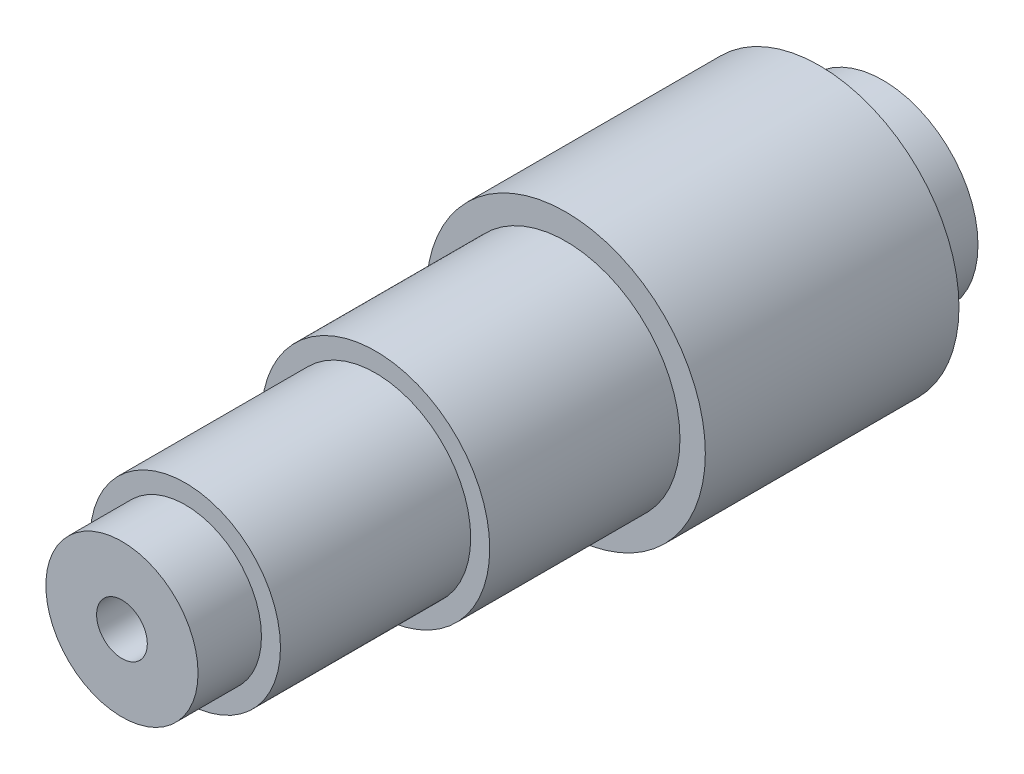
ISO-10303-21;
HEADER;
FILE_DESCRIPTION(('STEP AP214'),'2;1');
FILE_NAME('part.step','',(''),(''),'','','');
FILE_SCHEMA(('AUTOMOTIVE_DESIGN { 1 0 10303 214 1 1 1 1 }'));
ENDSEC;
DATA;
#1=APPLICATION_CONTEXT('core data for automotive mechanical design processes');
#2=APPLICATION_PROTOCOL_DEFINITION('international standard','automotive_design',2000,#1);
#3=PRODUCT_CONTEXT('',#1,'mechanical');
#4=PRODUCT('Part','Part','',(#3));
#5=PRODUCT_RELATED_PRODUCT_CATEGORY('part','',(#4));
#6=PRODUCT_DEFINITION_FORMATION('','',#4);
#7=PRODUCT_DEFINITION_CONTEXT('part definition',#1,'design');
#8=PRODUCT_DEFINITION('design','',#6,#7);
#9=PRODUCT_DEFINITION_SHAPE('','',#8);
#10=(LENGTH_UNIT() NAMED_UNIT(*) SI_UNIT(.MILLI.,.METRE.));
#11=(NAMED_UNIT(*) PLANE_ANGLE_UNIT() SI_UNIT($,.RADIAN.));
#12=(NAMED_UNIT(*) SI_UNIT($,.STERADIAN.) SOLID_ANGLE_UNIT());
#13=UNCERTAINTY_MEASURE_WITH_UNIT(LENGTH_MEASURE(1.E-05),#10,'distance_accuracy_value','');
#14=(GEOMETRIC_REPRESENTATION_CONTEXT(3) GLOBAL_UNCERTAINTY_ASSIGNED_CONTEXT((#13)) GLOBAL_UNIT_ASSIGNED_CONTEXT((#10,
#11,#12)) REPRESENTATION_CONTEXT('',''));
#15=CARTESIAN_POINT('',(0.,0.,0.));
#16=DIRECTION('',(0.,0.,1.));
#17=DIRECTION('',(1.,0.,0.));
#18=AXIS2_PLACEMENT_3D('',#15,#16,#17);
#19=CARTESIAN_POINT('',(0.,0.,80.));
#20=DIRECTION('',(0.,0.,1.));
#21=DIRECTION('',(1.,0.,0.));
#22=AXIS2_PLACEMENT_3D('',#19,#20,#21);
#23=PLANE('',#22);
#24=CARTESIAN_POINT('',(0.,0.,80.));
#25=DIRECTION('',(0.,0.,1.));
#26=DIRECTION('',(1.,0.,0.));
#27=AXIS2_PLACEMENT_3D('',#24,#25,#26);
#28=CIRCLE('',#27,15.);
#29=CARTESIAN_POINT('',(15.,0.,80.));
#30=VERTEX_POINT('',#29);
#31=EDGE_CURVE('E28',#30,#30,#28,.T.);
#32=ORIENTED_EDGE('',*,*,#31,.F.);
#33=EDGE_LOOP('',(#32));
#34=FACE_BOUND('',#33,.T.);
#35=CARTESIAN_POINT('',(0.,0.,80.));
#36=DIRECTION('',(0.,0.,1.));
#37=DIRECTION('',(1.,0.,0.));
#38=AXIS2_PLACEMENT_3D('',#35,#36,#37);
#39=CIRCLE('',#38,18.);
#40=CARTESIAN_POINT('',(18.,0.,80.));
#41=VERTEX_POINT('',#40);
#42=EDGE_CURVE('E46',#41,#41,#39,.T.);
#43=ORIENTED_EDGE('',*,*,#42,.T.);
#44=EDGE_LOOP('',(#43));
#45=FACE_BOUND('',#44,.T.);
#46=ADVANCED_FACE('F16',(#34,#45),#23,.T.);
#47=CARTESIAN_POINT('',(0.,0.,80.));
#48=DIRECTION('',(0.,0.,1.));
#49=DIRECTION('',(1.,0.,0.));
#50=AXIS2_PLACEMENT_3D('',#47,#48,#49);
#51=CYLINDRICAL_SURFACE('',#50,15.);
#52=ORIENTED_EDGE('',*,*,#31,.T.);
#53=DIRECTION('',(0.,0.,1.));
#54=VECTOR('',#53,1.);
#55=CARTESIAN_POINT('',(15.,0.,80.));
#56=LINE('',#55,#54);
#57=CARTESIAN_POINT('',(15.,0.,110.));
#58=VERTEX_POINT('',#57);
#59=EDGE_CURVE('E10',#30,#58,#56,.T.);
#60=ORIENTED_EDGE('',*,*,#59,.T.);
#61=CARTESIAN_POINT('',(0.,0.,110.));
#62=DIRECTION('',(0.,0.,1.));
#63=DIRECTION('',(1.,0.,0.));
#64=AXIS2_PLACEMENT_3D('',#61,#62,#63);
#65=CIRCLE('',#64,15.);
#66=EDGE_CURVE('E131',#58,#58,#65,.T.);
#67=ORIENTED_EDGE('',*,*,#66,.F.);
#68=ORIENTED_EDGE('',*,*,#59,.F.);
#69=EDGE_LOOP('',(#52,#60,#67,#68));
#70=FACE_BOUND('',#69,.T.);
#71=ADVANCED_FACE('F18',(#70),#51,.T.);
#72=CARTESIAN_POINT('',(0.,0.,50.));
#73=DIRECTION('',(0.,0.,1.));
#74=DIRECTION('',(1.,0.,0.));
#75=AXIS2_PLACEMENT_3D('',#72,#73,#74);
#76=CYLINDRICAL_SURFACE('',#75,18.);
#77=CARTESIAN_POINT('',(0.,0.,50.));
#78=DIRECTION('',(0.,0.,1.));
#79=DIRECTION('',(1.,0.,0.));
#80=AXIS2_PLACEMENT_3D('',#77,#78,#79);
#81=CIRCLE('',#80,18.);
#82=CARTESIAN_POINT('',(18.,0.,50.));
#83=VERTEX_POINT('',#82);
#84=EDGE_CURVE('E136',#83,#83,#81,.T.);
#85=ORIENTED_EDGE('',*,*,#84,.T.);
#86=DIRECTION('',(0.,0.,1.));
#87=VECTOR('',#86,1.);
#88=CARTESIAN_POINT('',(18.,0.,50.));
#89=LINE('',#88,#87);
#90=EDGE_CURVE('E135',#83,#41,#89,.T.);
#91=ORIENTED_EDGE('',*,*,#90,.T.);
#92=ORIENTED_EDGE('',*,*,#42,.F.);
#93=ORIENTED_EDGE('',*,*,#90,.F.);
#94=EDGE_LOOP('',(#85,#91,#92,#93));
#95=FACE_BOUND('',#94,.T.);
#96=ADVANCED_FACE('F352',(#95),#76,.T.);
#97=CARTESIAN_POINT('',(0.,0.,110.));
#98=DIRECTION('',(0.,0.,1.));
#99=DIRECTION('',(1.,0.,0.));
#100=AXIS2_PLACEMENT_3D('',#97,#98,#99);
#101=PLANE('',#100);
#102=CARTESIAN_POINT('',(0.,0.,110.));
#103=DIRECTION('',(0.,0.,1.));
#104=DIRECTION('',(1.,0.,0.));
#105=AXIS2_PLACEMENT_3D('',#102,#103,#104);
#106=CIRCLE('',#105,12.);
#107=CARTESIAN_POINT('',(12.,0.,110.));
#108=VERTEX_POINT('',#107);
#109=EDGE_CURVE('E162',#108,#108,#106,.T.);
#110=ORIENTED_EDGE('',*,*,#109,.F.);
#111=EDGE_LOOP('',(#110));
#112=FACE_BOUND('',#111,.T.);
#113=ORIENTED_EDGE('',*,*,#66,.T.);
#114=EDGE_LOOP('',(#113));
#115=FACE_BOUND('',#114,.T.);
#116=ADVANCED_FACE('F355',(#112,#115),#101,.T.);
#117=CARTESIAN_POINT('',(0.,0.,50.));
#118=DIRECTION('',(0.,0.,1.));
#119=DIRECTION('',(1.,0.,0.));
#120=AXIS2_PLACEMENT_3D('',#117,#118,#119);
#121=PLANE('',#120);
#122=ORIENTED_EDGE('',*,*,#84,.F.);
#123=EDGE_LOOP('',(#122));
#124=FACE_BOUND('',#123,.T.);
#125=CARTESIAN_POINT('',(0.,0.,50.));
#126=DIRECTION('',(0.,0.,1.));
#127=DIRECTION('',(1.,0.,0.));
#128=AXIS2_PLACEMENT_3D('',#125,#126,#127);
#129=CIRCLE('',#128,22.);
#130=CARTESIAN_POINT('',(22.,0.,50.));
#131=VERTEX_POINT('',#130);
#132=EDGE_CURVE('E161',#131,#131,#129,.T.);
#133=ORIENTED_EDGE('',*,*,#132,.T.);
#134=EDGE_LOOP('',(#133));
#135=FACE_BOUND('',#134,.T.);
#136=ADVANCED_FACE('F264',(#124,#135),#121,.T.);
#137=CARTESIAN_POINT('',(0.,0.,110.));
#138=DIRECTION('',(0.,0.,1.));
#139=DIRECTION('',(1.,0.,0.));
#140=AXIS2_PLACEMENT_3D('',#137,#138,#139);
#141=CYLINDRICAL_SURFACE('',#140,12.);
#142=ORIENTED_EDGE('',*,*,#109,.T.);
#143=DIRECTION('',(0.,0.,1.));
#144=VECTOR('',#143,1.);
#145=CARTESIAN_POINT('',(12.,0.,110.));
#146=LINE('',#145,#144);
#147=CARTESIAN_POINT('',(12.,0.,120.));
#148=VERTEX_POINT('',#147);
#149=EDGE_CURVE('E166',#108,#148,#146,.T.);
#150=ORIENTED_EDGE('',*,*,#149,.T.);
#151=CARTESIAN_POINT('',(0.,0.,120.));
#152=DIRECTION('',(0.,0.,1.));
#153=DIRECTION('',(1.,0.,0.));
#154=AXIS2_PLACEMENT_3D('',#151,#152,#153);
#155=CIRCLE('',#154,12.);
#156=EDGE_CURVE('E152',#148,#148,#155,.T.);
#157=ORIENTED_EDGE('',*,*,#156,.F.);
#158=ORIENTED_EDGE('',*,*,#149,.F.);
#159=EDGE_LOOP('',(#142,#150,#157,#158));
#160=FACE_BOUND('',#159,.T.);
#161=ADVANCED_FACE('F362',(#160),#141,.T.);
#162=CARTESIAN_POINT('',(0.,0.,10.));
#163=DIRECTION('',(0.,0.,1.));
#164=DIRECTION('',(1.,0.,0.));
#165=AXIS2_PLACEMENT_3D('',#162,#163,#164);
#166=CYLINDRICAL_SURFACE('',#165,22.);
#167=CARTESIAN_POINT('',(0.,0.,10.));
#168=DIRECTION('',(0.,0.,1.));
#169=DIRECTION('',(1.,0.,0.));
#170=AXIS2_PLACEMENT_3D('',#167,#168,#169);
#171=CIRCLE('',#170,22.);
#172=CARTESIAN_POINT('',(22.,0.,10.));
#173=VERTEX_POINT('',#172);
#174=EDGE_CURVE('E142',#173,#173,#171,.T.);
#175=ORIENTED_EDGE('',*,*,#174,.T.);
#176=DIRECTION('',(0.,0.,1.));
#177=VECTOR('',#176,1.);
#178=CARTESIAN_POINT('',(22.,0.,10.));
#179=LINE('',#178,#177);
#180=EDGE_CURVE('E156',#173,#131,#179,.T.);
#181=ORIENTED_EDGE('',*,*,#180,.T.);
#182=ORIENTED_EDGE('',*,*,#132,.F.);
#183=ORIENTED_EDGE('',*,*,#180,.F.);
#184=EDGE_LOOP('',(#175,#181,#182,#183));
#185=FACE_BOUND('',#184,.T.);
#186=ADVANCED_FACE('F263',(#185),#166,.T.);
#187=CARTESIAN_POINT('',(0.,0.,120.));
#188=DIRECTION('',(0.,0.,1.));
#189=DIRECTION('',(1.,0.,0.));
#190=AXIS2_PLACEMENT_3D('',#187,#188,#189);
#191=PLANE('',#190);
#192=CARTESIAN_POINT('',(0.,0.,120.));
#193=DIRECTION('',(0.,0.,-1.));
#194=DIRECTION('',(1.,0.,0.));
#195=AXIS2_PLACEMENT_3D('',#192,#193,#194);
#196=CIRCLE('',#195,4.);
#197=CARTESIAN_POINT('',(4.,0.,120.));
#198=VERTEX_POINT('',#197);
#199=EDGE_CURVE('E137',#198,#198,#196,.T.);
#200=ORIENTED_EDGE('',*,*,#199,.T.);
#201=EDGE_LOOP('',(#200));
#202=FACE_BOUND('',#201,.T.);
#203=ORIENTED_EDGE('',*,*,#156,.T.);
#204=EDGE_LOOP('',(#203));
#205=FACE_BOUND('',#204,.T.);
#206=ADVANCED_FACE('F202',(#202,#205),#191,.T.);
#207=CARTESIAN_POINT('',(1.5155,0.,0.4375));
#208=CARTESIAN_POINT('',(3.402393074912,0.479611392546,0.460817608106));
#209=CARTESIAN_POINT('',(5.116920711234,2.273915754895,0.520411328068));
#210=CARTESIAN_POINT('',(5.902808231949,5.316430468505,0.615382807903));
#211=CARTESIAN_POINT('',(4.978240031538,9.082938753713,0.748265761617));
#212=CARTESIAN_POINT('',(1.990043169276,12.58856914041,0.9138210966));
#213=CARTESIAN_POINT('',(-2.924226933672,14.658866904373,1.120147120799));
#214=CARTESIAN_POINT('',(-8.767328616036,14.37485235099,1.357821338647));
#215=CARTESIAN_POINT('',(-14.34258800773,11.493958477222,1.634710819825));
#216=CARTESIAN_POINT('',(-18.45080375576,6.427195028999,1.945905064948));
#217=CARTESIAN_POINT('',(-20.3366596334,0.05209941645208,2.293297334482));
#218=CARTESIAN_POINT('',(-22.22240311658,-6.322997026243,2.640673979179));
#219=CARTESIAN_POINT('',(-21.87999161717,-14.00730158028,3.023438283921));
#220=CARTESIAN_POINT('',(-18.55226095051,-22.12169037234,3.442902493528));
#221=CARTESIAN_POINT('',(-11.83337665121,-29.33920089672,3.896441355612));
#222=CARTESIAN_POINT('',(-2.10156022312,-34.0531217601,4.385471531116));
#223=CARTESIAN_POINT('',(9.529332184227,-34.88306114543,4.91257780741));
#224=CARTESIAN_POINT('',(21.10030150827,-31.14833019398,5.46916351957));
#225=CARTESIAN_POINT('',(30.712389118464,-23.25397205846,6.066244878642));
#226=CARTESIAN_POINT('',(36.825685446813,-12.40470621421,6.694115112968));
#227=CARTESIAN_POINT('',(38.709446183388,-0.274728714199,7.357943894031));
#228=CARTESIAN_POINT('',(-1.5155,0.,0.4375));
#229=CARTESIAN_POINT('',(0.371393074913,-0.46980809349,0.408617479808));
#230=CARTESIAN_POINT('',(2.417355959542,0.37489894699,0.416148659816));
#231=CARTESIAN_POINT('',(3.866213435088,2.599022678202,0.458772997383));
#232=CARTESIAN_POINT('',(3.876899213397,5.806811410503,0.539742927108));
#233=CARTESIAN_POINT('',(1.978901282863,9.116530719101,0.653229350093));
#234=CARTESIAN_POINT('',(-1.848106665434,11.386129925145,0.807399445798));
#235=CARTESIAN_POINT('',(-6.762457105953,11.660362247993,0.9935017398));
#236=CARTESIAN_POINT('',(-11.68246034699,9.592329079429,1.218472526964));
#237=CARTESIAN_POINT('',(-15.46442446361,5.464245332898,1.478167284807));
#238=CARTESIAN_POINT('',(-17.35057828473,0.02451465844215,1.774145853499));
#239=CARTESIAN_POINT('',(-19.23661917247,-5.415216681936,2.070111888369));
#240=CARTESIAN_POINT('',(-19.2210252537,-12.16728970778,2.401710816562));
#241=CARTESIAN_POINT('',(-16.54424122369,-19.48169387672,2.769958682475));
#242=CARTESIAN_POINT('',(-10.73959963305,-26.15697514808,3.172941720924));
#243=CARTESIAN_POINT('',(-2.068296010453,-30.68400243376,3.611191495813));
#244=CARTESIAN_POINT('',(8.510187967542,-31.71051619926,4.087954408512));
#245=CARTESIAN_POINT('',(19.186638988229,-28.51743318513,4.594669373541));
#246=CARTESIAN_POINT('',(28.170527772547,-21.40598170801,5.141810454707));
#247=CARTESIAN_POINT('',(33.972428698166,-11.45679678302,5.720351336437));
#248=CARTESIAN_POINT('',(35.856779767768,-0.22037826069,6.335055166262));
#249=(BOUNDED_SURFACE() B_SPLINE_SURFACE(1,10,((#207,#208,#209,#210,#211,#212,#213,#214,#215,
#216,#217,#218,#219,#220,#221,#222,#223,#224,#225,#226,#227),(#228,#229,#230,#231,#232,#233,
#234,#235,#236,#237,#238,#239,#240,#241,#242,#243,#244,#245,#246,#247,#248)),.UNSPECIFIED.,.F.,
.F.,.F.) B_SPLINE_SURFACE_WITH_KNOTS((2,2),(11,9,1,11),(0.,3.031),(0.,0.5,0.5000005,1.),
.UNSPECIFIED.) GEOMETRIC_REPRESENTATION_ITEM() RATIONAL_B_SPLINE_SURFACE(((1.,1.,1.,1.,1.,1.,1.,
1.,1.,1.,1.,1.,1.,1.,1.,1.,1.,1.,1.,1.,1.),(1.,1.,1.,1.,1.,1.,1.,1.,1.,1.,1.,1.,1.,1.,1.,1.,1.,
1.,1.,1.,1.))) REPRESENTATION_ITEM('') SURFACE());
#250=CARTESIAN_POINT('',(1.5155,0.,0.4375));
#251=CARTESIAN_POINT('',(3.402393074912,0.479611392546,0.460817608106));
#252=CARTESIAN_POINT('',(5.116920711234,2.273915754895,0.520411328068));
#253=CARTESIAN_POINT('',(5.902808231949,5.316430468505,0.615382807903));
#254=CARTESIAN_POINT('',(4.978240031538,9.082938753713,0.748265761617));
#255=CARTESIAN_POINT('',(1.990043169276,12.58856914041,0.9138210966));
#256=CARTESIAN_POINT('',(-2.924226933672,14.658866904373,1.120147120799));
#257=CARTESIAN_POINT('',(-8.767328616036,14.37485235099,1.357821338647));
#258=CARTESIAN_POINT('',(-14.34258800773,11.493958477222,1.634710819825));
#259=CARTESIAN_POINT('',(-18.45080375576,6.427195028999,1.945905064948));
#260=CARTESIAN_POINT('',(-20.3366596334,0.05209941645208,2.293297334482));
#261=CARTESIAN_POINT('',(-22.22240311658,-6.322997026243,2.640673979179));
#262=CARTESIAN_POINT('',(-21.87999161717,-14.00730158028,3.023438283921));
#263=CARTESIAN_POINT('',(-18.55226095051,-22.12169037234,3.442902493528));
#264=CARTESIAN_POINT('',(-11.83337665121,-29.33920089672,3.896441355612));
#265=CARTESIAN_POINT('',(-2.10156022312,-34.0531217601,4.385471531116));
#266=CARTESIAN_POINT('',(9.529332184227,-34.88306114543,4.91257780741));
#267=CARTESIAN_POINT('',(21.10030150827,-31.14833019398,5.46916351957));
#268=CARTESIAN_POINT('',(30.712389118464,-23.25397205846,6.066244878642));
#269=CARTESIAN_POINT('',(36.825685446813,-12.40470621421,6.694115112968));
#270=CARTESIAN_POINT('',(38.709446183388,-0.274728714199,7.357943894031));
#271=(BOUNDED_CURVE() B_SPLINE_CURVE(10,(#250,#251,#252,#253,#254,#255,#256,#257,#258,#259,#260,
#261,#262,#263,#264,#265,#266,#267,#268,#269,#270),.UNSPECIFIED.,.F.,
.F.) B_SPLINE_CURVE_WITH_KNOTS((11,9,1,11),(0.,0.5,0.5000005,1.),
.UNSPECIFIED.) CURVE() GEOMETRIC_REPRESENTATION_ITEM() RATIONAL_B_SPLINE_CURVE((1.,1.,1.,1.,1.,
1.,1.,1.,1.,1.,1.,1.,1.,1.,1.,1.,1.,1.,1.,1.,1.)) REPRESENTATION_ITEM(''));
#272=CARTESIAN_POINT('',(3.661261292306,1.610951814755,0.496412822207));
#273=VERTEX_POINT('',#272);
#274=CARTESIAN_POINT('',(-9.375339181256,11.709099676593,1.435178396942));
#275=VERTEX_POINT('',#274);
#276=EDGE_CURVE('E320',#273,#275,#271,.T.);
#277=CARTESIAN_POINT('',(2.421851776586,3.183493988096,0.491941061582));
#278=CARTESIAN_POINT('',(2.522494284354,3.106929924477,0.494841673041));
#279=CARTESIAN_POINT('',(2.61991981264,3.026115732131,0.49730577537));
#280=CARTESIAN_POINT('',(2.713855902493,2.94125563373,0.499333172147));
#281=CARTESIAN_POINT('',(2.894258091973,2.763922490141,0.502514242423));
#282=CARTESIAN_POINT('',(2.980724619241,2.671449552217,0.503667946758));
#283=CARTESIAN_POINT('',(3.063214275254,2.575406576045,0.50438471997));
#284=CARTESIAN_POINT('',(3.219817568093,2.376715277817,0.504944263259));
#285=CARTESIAN_POINT('',(3.293931352072,2.2740667857,0.504787034388));
#286=CARTESIAN_POINT('',(3.363646307471,2.168382690352,0.504192733704));
#287=CARTESIAN_POINT('',(3.493931663672,1.951523178685,0.502129907622));
#288=CARTESIAN_POINT('',(3.554501822564,1.84034737384,0.500661349274));
#289=CARTESIAN_POINT('',(3.610323575551,1.726719579479,0.498755641256));
#290=CARTESIAN_POINT('',(3.661261292306,1.610951814755,0.496412822207));
#291=(BOUNDED_CURVE() B_SPLINE_CURVE(4,(#277,#278,#279,#280,#281,#282,#283,#284,#285,#286,#287,
#288,#289,#290),.UNSPECIFIED.,.F.,.F.) B_SPLINE_CURVE_WITH_KNOTS((5,3,3,3,5),(0.,0.250004413169,
0.500000012832,0.749995265298,1.),
.UNSPECIFIED.) CURVE() GEOMETRIC_REPRESENTATION_ITEM() RATIONAL_B_SPLINE_CURVE((1.,1.,1.,1.,1.,
1.,1.,1.,1.,1.,1.,1.,1.,1.)) REPRESENTATION_ITEM(''));
#292=CARTESIAN_POINT('',(2.421851776586,3.183493988096,0.491941061582));
#293=VERTEX_POINT('',#292);
#294=EDGE_CURVE('E140',#293,#273,#291,.T.);
#295=CARTESIAN_POINT('',(-1.51549981481574,0.,0.4375));
#296=CARTESIAN_POINT('',(0.371393260097255,-0.469808035483553,0.408617482997258));
#297=CARTESIAN_POINT('',(2.41735612447664,0.374899063013759,0.41614866618611));
#298=CARTESIAN_POINT('',(3.86621355951733,2.59902284422679,0.458773006951351));
#299=CARTESIAN_POINT('',(3.87689928068535,5.80681161066374,0.539742939848068));
#300=CARTESIAN_POINT('',(1.97890128354373,9.11653093123127,0.653229366014309));
#301=CARTESIAN_POINT('',(-1.84810673118145,11.3861301250986,0.807399464905867));
#302=CARTESIAN_POINT('',(-6.76245722844414,11.6603624138395,0.993501762058744));
#303=CARTESIAN_POINT('',(-11.6824605095152,9.59232919561238,1.21847255239481));
#304=CARTESIAN_POINT('',(-15.4644246460681,5.4642453917311,1.47816731338426));
#305=CARTESIAN_POINT('',(-17.3505784671699,0.0245146601274891,1.77414588521747));
#306=CARTESIAN_POINT('',(-19.2366193548917,-5.41521673739843,2.07011192322849));
#307=CARTESIAN_POINT('',(-19.2210254161542,-12.1672898201988,2.40171085454753));
#308=CARTESIAN_POINT('',(-16.5442413463735,-19.4816940380152,2.76995872358968));
#309=CARTESIAN_POINT('',(-10.7395996998762,-26.1569753425037,3.17294176512748));
#310=CARTESIAN_POINT('',(-2.06829601248534,-30.6840026396022,3.61119154311899));
#311=CARTESIAN_POINT('',(8.5101880298084,-31.7105163930922,4.08795445889381));
#312=CARTESIAN_POINT('',(19.1866391051476,-28.5174333458693,4.59466942696975));
#313=CARTESIAN_POINT('',(28.1705279278465,-21.4059818209162,5.14181051118694));
#314=CARTESIAN_POINT('',(33.9724288724907,-11.4567968409342,5.7203513959308));
#315=CARTESIAN_POINT('',(35.8567799420567,-0.220378264010636,6.33505522875718));
#316=(BOUNDED_CURVE() B_SPLINE_CURVE(10,(#295,#296,#297,#298,#299,#300,#301,#302,#303,#304,#305,
#306,#307,#308,#309,#310,#311,#312,#313,#314,#315),.UNSPECIFIED.,.F.,
.F.) B_SPLINE_CURVE_WITH_KNOTS((11,9,1,11),(0.,0.5,0.5000005,1.),
.UNSPECIFIED.) CURVE() GEOMETRIC_REPRESENTATION_ITEM() RATIONAL_B_SPLINE_CURVE((1.,1.,1.,1.,1.,
1.,1.,1.,1.,1.,1.,1.,1.,1.,1.,1.,1.,1.,1.,1.,1.)) REPRESENTATION_ITEM(''));
#317=CARTESIAN_POINT('',(-13.8531549113,5.752399412724,1.429449729147));
#318=VERTEX_POINT('',#317);
#319=EDGE_CURVE('E157',#293,#318,#316,.T.);
#320=CARTESIAN_POINT('',(-13.8531549113,5.752399412724,1.429449729147));
#321=CARTESIAN_POINT('',(-13.67298827883,6.186283795637,1.432452749044));
#322=CARTESIAN_POINT('',(-13.47468957751,6.612675421907,1.435013969642));
#323=CARTESIAN_POINT('',(-13.25872579868,7.030433452274,1.437133914994));
#324=CARTESIAN_POINT('',(-12.79243793424,7.846961091187,1.440494206657));
#325=CARTESIAN_POINT('',(-12.54207767972,8.245711192297,1.441733629794));
#326=CARTESIAN_POINT('',(-12.27523190239,8.633656619334,1.442532055099));
#327=CARTESIAN_POINT('',(-11.7097704186,9.386322955494,1.443248516813));
#328=CARTESIAN_POINT('',(-11.41112306494,9.751021337901,1.443165681705));
#329=CARTESIAN_POINT('',(-11.09744080005,10.102903338274,1.442642229396));
#330=CARTESIAN_POINT('',(-10.44143180215,10.779552628647,1.44071436561));
#331=CARTESIAN_POINT('',(-10.09907855061,11.104295590852,1.439309149653));
#332=CARTESIAN_POINT('',(-9.743390649836,11.414405169808,1.437463662038));
#333=CARTESIAN_POINT('',(-9.375339181256,11.709099676593,1.435178396942));
#334=(BOUNDED_CURVE() B_SPLINE_CURVE(4,(#320,#321,#322,#323,#324,#325,#326,#327,#328,#329,#330,
#331,#332,#333),.UNSPECIFIED.,.F.,.F.) B_SPLINE_CURVE_WITH_KNOTS((5,3,3,3,5),(0.,0.24962379835,
0.499508800478,0.749640356011,1.),
.UNSPECIFIED.) CURVE() GEOMETRIC_REPRESENTATION_ITEM() RATIONAL_B_SPLINE_CURVE((1.,1.,1.,1.,1.,
1.,1.,1.,1.,1.,1.,1.,1.,1.)) REPRESENTATION_ITEM(''));
#335=EDGE_CURVE('E236',#318,#275,#334,.T.);
#336=ORIENTED_EDGE('',*,*,#276,.F.);
#337=ORIENTED_EDGE('',*,*,#294,.F.);
#338=ORIENTED_EDGE('',*,*,#319,.T.);
#339=ORIENTED_EDGE('',*,*,#335,.T.);
#340=EDGE_LOOP('',(#336,#337,#338,#339));
#341=FACE_BOUND('',#340,.T.);
#342=ADVANCED_FACE('F189',(#341),#249,.T.);
#343=CARTESIAN_POINT('',(-1.5155,0.,0.4375));
#344=CARTESIAN_POINT('',(0.371393074913,-0.46980809349,0.408617479808));
#345=CARTESIAN_POINT('',(2.417355959542,0.37489894699,0.416148659816));
#346=CARTESIAN_POINT('',(3.866213435088,2.599022678202,0.458772997383));
#347=CARTESIAN_POINT('',(3.876899213397,5.806811410503,0.539742927108));
#348=CARTESIAN_POINT('',(1.978901282863,9.116530719101,0.653229350094));
#349=CARTESIAN_POINT('',(-1.848106665435,11.386129925145,0.807399445798));
#350=CARTESIAN_POINT('',(-6.762457105952,11.660362247993,0.9935017398));
#351=CARTESIAN_POINT('',(-11.68246034699,9.592329079429,1.218472526964));
#352=CARTESIAN_POINT('',(-15.46442446361,5.464245332898,1.478167284807));
#353=CARTESIAN_POINT('',(-17.35057828473,0.02451465844214,1.774145853499));
#354=CARTESIAN_POINT('',(-19.23661917247,-5.415216681936,2.070111888369));
#355=CARTESIAN_POINT('',(-19.2210252537,-12.16728970778,2.401710816562));
#356=CARTESIAN_POINT('',(-16.54424122368,-19.48169387673,2.769958682475));
#357=CARTESIAN_POINT('',(-10.73959963305,-26.15697514808,3.172941720924));
#358=CARTESIAN_POINT('',(-2.068296010449,-30.68400243376,3.611191495813));
#359=CARTESIAN_POINT('',(8.510187967539,-31.71051619926,4.087954408513));
#360=CARTESIAN_POINT('',(19.186638988231,-28.51743318513,4.594669373541));
#361=CARTESIAN_POINT('',(28.170527772546,-21.40598170801,5.141810454707));
#362=CARTESIAN_POINT('',(33.972428698166,-11.45679678302,5.720351336437));
#363=CARTESIAN_POINT('',(35.856779767768,-0.22037826069,6.335055166262));
#364=CARTESIAN_POINT('',(0.,0.,0.));
#365=CARTESIAN_POINT('',(1.894427735464,0.004901897782642,-0.002782456042913));
#366=CARTESIAN_POINT('',(3.782187623936,1.32965857106,0.03092417453794));
#367=CARTESIAN_POINT('',(4.904034599493,3.973469993534,0.100008930031));
#368=CARTESIAN_POINT('',(4.445291318495,7.474530574897,0.207371473497));
#369=CARTESIAN_POINT('',(1.992473556593,10.89578570163,0.347459685475));
#370=CARTESIAN_POINT('',(-2.395562802775,13.074402682446,0.528438309312));
#371=CARTESIAN_POINT('',(-7.795699275625,13.069508202221,0.741179439983));
#372=CARTESIAN_POINT('',(-13.06421937901,10.58522482383,0.993120744068));
#373=CARTESIAN_POINT('',(-17.02502031889,5.969536489041,1.279711341485));
#374=CARTESIAN_POINT('',(-18.91855421955,0.03865051317334,1.602686979649));
#375=CARTESIAN_POINT('',(-20.81197501013,-5.892236214851,1.925648460915));
#376=CARTESIAN_POINT('',(-20.63229595345,-13.13911032363,2.284260323225));
#377=CARTESIAN_POINT('',(-17.61814570562,-20.88416162055,2.679693405458));
#378=CARTESIAN_POINT('',(-11.33154645111,-27.85816872069,3.109664222553));
#379=CARTESIAN_POINT('',(-2.093483209639,-32.49700385231,3.575156889506));
#380=CARTESIAN_POINT('',(9.055251414737,-33.42895947767,4.079094073757));
#381=CARTESIAN_POINT('',(20.223076389534,-29.95135112509,4.612862397628));
#382=CARTESIAN_POINT('',(29.55794010848,-22.41875418764,5.187253649773));
#383=CARTESIAN_POINT('',(35.539183429487,-11.97836307987,5.792859185071));
#384=CARTESIAN_POINT('',(37.43075857709,-0.248917369764,6.434668052259));
#385=(BOUNDED_SURFACE() B_SPLINE_SURFACE(1,10,((#343,#344,#345,#346,#347,#348,#349,#350,#351,
#352,#353,#354,#355,#356,#357,#358,#359,#360,#361,#362,#363),(#364,#365,#366,#367,#368,#369,
#370,#371,#372,#373,#374,#375,#376,#377,#378,#379,#380,#381,#382,#383,#384)),.UNSPECIFIED.,.F.,
.F.,.F.) B_SPLINE_SURFACE_WITH_KNOTS((2,2),(11,9,1,11),(0.,1.577385970522),(0.,0.5,0.5000005,
1.),.UNSPECIFIED.) GEOMETRIC_REPRESENTATION_ITEM() RATIONAL_B_SPLINE_SURFACE(((1.,1.,1.,1.,1.,
1.,1.,1.,1.,1.,1.,1.,1.,1.,1.,1.,1.,1.,1.,1.,1.),(1.,1.,1.,1.,1.,1.,1.,1.,1.,1.,1.,1.,1.,1.,1.,
1.,1.,1.,1.,1.,1.))) REPRESENTATION_ITEM('') SURFACE());
#386=CARTESIAN_POINT('',(3.148069846346,2.467722886089,0.06689778453916));
#387=CARTESIAN_POINT('',(3.108810185584,2.517806367877,0.09411069134738));
#388=CARTESIAN_POINT('',(3.06845456182,2.567099892564,0.121220207061));
#389=CARTESIAN_POINT('',(3.027025517278,2.615566270949,0.148226055706));
#390=CARTESIAN_POINT('',(2.942096073839,2.710744594172,0.202013884781));
#391=CARTESIAN_POINT('',(2.898596918017,2.75745757165,0.228795989049));
#392=CARTESIAN_POINT('',(2.854075779886,2.803272653737,0.25547400685));
#393=CARTESIAN_POINT('',(2.763071516266,2.893011771636,0.308605676482));
#394=CARTESIAN_POINT('',(2.716589558875,2.936936912531,0.335059451553));
#395=CARTESIAN_POINT('',(2.66914189927,2.979896513584,0.361408727986));
#396=CARTESIAN_POINT('',(2.572403334662,3.063794706361,0.413882421349));
#397=CARTESIAN_POINT('',(2.523113518814,3.104734470663,0.440006960959));
#398=CARTESIAN_POINT('',(2.472918931168,3.144644510286,0.466026595258));
#399=CARTESIAN_POINT('',(2.421851776586,3.183493988096,0.491941061582));
#400=(BOUNDED_CURVE() B_SPLINE_CURVE(4,(#386,#387,#388,#389,#390,#391,#392,#393,#394,#395,#396,
#397,#398,#399),.UNSPECIFIED.,.F.,.F.) B_SPLINE_CURVE_WITH_KNOTS((5,3,3,3,5),(0.,0.250221723356,
0.500294715173,0.750220363266,1.),
.UNSPECIFIED.) CURVE() GEOMETRIC_REPRESENTATION_ITEM() RATIONAL_B_SPLINE_CURVE((1.,1.,1.,1.,1.,
1.,1.,1.,1.,1.,1.,1.,1.,1.)) REPRESENTATION_ITEM(''));
#401=CARTESIAN_POINT('',(3.148069846346,2.467722886089,0.06689778453916));
#402=VERTEX_POINT('',#401);
#403=EDGE_CURVE('E147',#402,#293,#400,.T.);
#404=CARTESIAN_POINT('',(0.,0.,0.));
#405=CARTESIAN_POINT('',(1.894427735464,0.004901897782642,-0.002782456042913));
#406=CARTESIAN_POINT('',(3.782187623936,1.32965857106,0.03092417453794));
#407=CARTESIAN_POINT('',(4.904034599493,3.973469993534,0.100008930031));
#408=CARTESIAN_POINT('',(4.445291318495,7.474530574897,0.207371473497));
#409=CARTESIAN_POINT('',(1.992473556593,10.89578570163,0.347459685475));
#410=CARTESIAN_POINT('',(-2.395562802775,13.074402682446,0.528438309312));
#411=CARTESIAN_POINT('',(-7.795699275625,13.069508202221,0.741179439983));
#412=CARTESIAN_POINT('',(-13.06421937901,10.58522482383,0.993120744068));
#413=CARTESIAN_POINT('',(-17.02502031889,5.969536489041,1.279711341485));
#414=CARTESIAN_POINT('',(-18.91855421955,0.03865051317334,1.602686979649));
#415=CARTESIAN_POINT('',(-20.81197501013,-5.892236214851,1.925648460915));
#416=CARTESIAN_POINT('',(-20.63229595345,-13.13911032363,2.284260323225));
#417=CARTESIAN_POINT('',(-17.61814570562,-20.88416162055,2.679693405458));
#418=CARTESIAN_POINT('',(-11.33154645111,-27.85816872069,3.109664222553));
#419=CARTESIAN_POINT('',(-2.093483209639,-32.49700385231,3.575156889506));
#420=CARTESIAN_POINT('',(9.055251414737,-33.42895947767,4.079094073757));
#421=CARTESIAN_POINT('',(20.223076389534,-29.95135112509,4.612862397628));
#422=CARTESIAN_POINT('',(29.55794010848,-22.41875418764,5.187253649773));
#423=CARTESIAN_POINT('',(35.539183429487,-11.97836307987,5.792859185071));
#424=CARTESIAN_POINT('',(37.43075857709,-0.248917369764,6.434668052259));
#425=(BOUNDED_CURVE() B_SPLINE_CURVE(10,(#404,#405,#406,#407,#408,#409,#410,#411,#412,#413,#414,
#415,#416,#417,#418,#419,#420,#421,#422,#423,#424),.UNSPECIFIED.,.F.,
.F.) B_SPLINE_CURVE_WITH_KNOTS((11,9,1,11),(0.,0.5,0.5000005,1.),
.UNSPECIFIED.) CURVE() GEOMETRIC_REPRESENTATION_ITEM() RATIONAL_B_SPLINE_CURVE((1.,1.,1.,1.,1.,
1.,1.,1.,1.,1.,1.,1.,1.,1.,1.,1.,1.,1.,1.,1.,1.)) REPRESENTATION_ITEM(''));
#426=CARTESIAN_POINT('',(-11.90259317392,9.128432271537,1.001388777332));
#427=VERTEX_POINT('',#426);
#428=EDGE_CURVE('E146',#402,#427,#425,.T.);
#429=CARTESIAN_POINT('',(-11.90259317392,9.128432271537,1.001388777332));
#430=CARTESIAN_POINT('',(-12.05097072293,8.934962292303,1.028816295595));
#431=CARTESIAN_POINT('',(-12.19517896944,8.738245696281,1.056125418014));
#432=CARTESIAN_POINT('',(-12.33511011005,8.53841680691,1.083316222124));
#433=CARTESIAN_POINT('',(-12.60634509478,8.132630320238,1.13748624291));
#434=CARTESIAN_POINT('',(-12.73764090102,7.92666722308,1.164465242941));
#435=CARTESIAN_POINT('',(-12.86445344781,7.717869252797,1.191325840642));
#436=CARTESIAN_POINT('',(-13.10904325155,7.29470778303,1.244834597007));
#437=CARTESIAN_POINT('',(-13.22681222739,7.080339377138,1.271482542087));
#438=CARTESIAN_POINT('',(-13.33990976848,6.863427646499,1.298011979374));
#439=CARTESIAN_POINT('',(-13.55669865888,6.424629214935,1.350857616986));
#440=CARTESIAN_POINT('',(-13.6603814967,6.202738195083,1.377173606051));
#441=CARTESIAN_POINT('',(-13.75922366463,5.97860834186,1.403370963417));
#442=CARTESIAN_POINT('',(-13.8531549113,5.752399412724,1.429449729147));
#443=(BOUNDED_CURVE() B_SPLINE_CURVE(4,(#429,#430,#431,#432,#433,#434,#435,#436,#437,#438,#439,
#440,#441,#442),.UNSPECIFIED.,.F.,.F.) B_SPLINE_CURVE_WITH_KNOTS((5,3,3,3,5),(0.,0.24965824591,
0.499546267162,0.749660956055,1.),
.UNSPECIFIED.) CURVE() GEOMETRIC_REPRESENTATION_ITEM() RATIONAL_B_SPLINE_CURVE((1.,1.,1.,1.,1.,
1.,1.,1.,1.,1.,1.,1.,1.,1.)) REPRESENTATION_ITEM(''));
#444=EDGE_CURVE('E151',#427,#318,#443,.T.);
#445=ORIENTED_EDGE('',*,*,#319,.F.);
#446=ORIENTED_EDGE('',*,*,#403,.F.);
#447=ORIENTED_EDGE('',*,*,#428,.T.);
#448=ORIENTED_EDGE('',*,*,#444,.T.);
#449=EDGE_LOOP('',(#445,#446,#447,#448));
#450=FACE_BOUND('',#449,.T.);
#451=ADVANCED_FACE('F201',(#450),#385,.T.);
#452=CARTESIAN_POINT('',(0.,0.,0.));
#453=CARTESIAN_POINT('',(1.894427735464,0.004901897782639,-0.002782456042917));
#454=CARTESIAN_POINT('',(3.782187623936,1.32965857106,0.03092417453796));
#455=CARTESIAN_POINT('',(4.904034599493,3.973469993534,0.100008930031));
#456=CARTESIAN_POINT('',(4.445291318495,7.474530574898,0.207371473497));
#457=CARTESIAN_POINT('',(1.992473556594,10.89578570163,0.347459685475));
#458=CARTESIAN_POINT('',(-2.395562802776,13.074402682446,0.528438309312));
#459=CARTESIAN_POINT('',(-7.795699275624,13.069508202221,0.741179439983));
#460=CARTESIAN_POINT('',(-13.06421937901,10.58522482383,0.993120744068));
#461=CARTESIAN_POINT('',(-17.02502031889,5.969536489041,1.279711341485));
#462=CARTESIAN_POINT('',(-18.91855421955,0.03865051317334,1.602686979649));
#463=CARTESIAN_POINT('',(-20.81197501013,-5.892236214851,1.925648460915));
#464=CARTESIAN_POINT('',(-20.63229595345,-13.13911032363,2.284260323225));
#465=CARTESIAN_POINT('',(-17.61814570562,-20.88416162055,2.679693405458));
#466=CARTESIAN_POINT('',(-11.33154645111,-27.85816872069,3.109664222553));
#467=CARTESIAN_POINT('',(-2.093483209638,-32.49700385231,3.575156889506));
#468=CARTESIAN_POINT('',(9.055251414736,-33.42895947767,4.079094073757));
#469=CARTESIAN_POINT('',(20.223076389535,-29.95135112509,4.612862397628));
#470=CARTESIAN_POINT('',(29.557940108479,-22.41875418763,5.187253649773));
#471=CARTESIAN_POINT('',(35.539183429487,-11.97836307987,5.792859185071));
#472=CARTESIAN_POINT('',(37.43075857709,-0.248917369764,6.434668052259));
#473=CARTESIAN_POINT('',(1.5155,0.,0.4375));
#474=CARTESIAN_POINT('',(3.402393074912,0.479611392546,0.460817608106));
#475=CARTESIAN_POINT('',(5.116920711234,2.273915754895,0.520411328068));
#476=CARTESIAN_POINT('',(5.902808231949,5.316430468505,0.615382807903));
#477=CARTESIAN_POINT('',(4.978240031538,9.082938753713,0.748265761617));
#478=CARTESIAN_POINT('',(1.990043169276,12.58856914041,0.9138210966));
#479=CARTESIAN_POINT('',(-2.924226933672,14.658866904373,1.120147120799));
#480=CARTESIAN_POINT('',(-8.767328616036,14.37485235099,1.357821338647));
#481=CARTESIAN_POINT('',(-14.34258800773,11.493958477222,1.634710819825));
#482=CARTESIAN_POINT('',(-18.45080375576,6.427195028999,1.945905064948));
#483=CARTESIAN_POINT('',(-20.3366596334,0.05209941645208,2.293297334482));
#484=CARTESIAN_POINT('',(-22.22240311658,-6.322997026243,2.640673979179));
#485=CARTESIAN_POINT('',(-21.87999161717,-14.00730158028,3.023438283921));
#486=CARTESIAN_POINT('',(-18.55226095051,-22.12169037234,3.442902493528));
#487=CARTESIAN_POINT('',(-11.83337665121,-29.33920089672,3.896441355612));
#488=CARTESIAN_POINT('',(-2.10156022312,-34.0531217601,4.385471531116));
#489=CARTESIAN_POINT('',(9.529332184227,-34.88306114543,4.91257780741));
#490=CARTESIAN_POINT('',(21.10030150827,-31.14833019398,5.46916351957));
#491=CARTESIAN_POINT('',(30.712389118464,-23.25397205846,6.066244878642));
#492=CARTESIAN_POINT('',(36.825685446813,-12.40470621421,6.694115112968));
#493=CARTESIAN_POINT('',(38.709446183388,-0.274728714199,7.357943894031));
#494=(BOUNDED_SURFACE() B_SPLINE_SURFACE(1,10,((#452,#453,#454,#455,#456,#457,#458,#459,#460,
#461,#462,#463,#464,#465,#466,#467,#468,#469,#470,#471,#472),(#473,#474,#475,#476,#477,#478,
#479,#480,#481,#482,#483,#484,#485,#486,#487,#488,#489,#490,#491,#492,#493)),.UNSPECIFIED.,.F.,
.F.,.F.) B_SPLINE_SURFACE_WITH_KNOTS((2,2),(11,9,1,11),(0.,1.577385970522),(0.,0.5,0.5000005,
1.),.UNSPECIFIED.) GEOMETRIC_REPRESENTATION_ITEM() RATIONAL_B_SPLINE_SURFACE(((1.,1.,1.,1.,1.,
1.,1.,1.,1.,1.,1.,1.,1.,1.,1.,1.,1.,1.,1.,1.,1.),(1.,1.,1.,1.,1.,1.,1.,1.,1.,1.,1.,1.,1.,1.,1.,
1.,1.,1.,1.,1.,1.))) REPRESENTATION_ITEM('') SURFACE());
#495=CARTESIAN_POINT('',(3.661261292306,1.610951814755,0.496412822207));
#496=CARTESIAN_POINT('',(3.635849263965,1.66870653769,0.47011313473));
#497=CARTESIAN_POINT('',(3.609244062296,1.725877759877,0.443707703626));
#498=CARTESIAN_POINT('',(3.581467271745,1.782429030967,0.417196830625));
#499=CARTESIAN_POINT('',(3.52371560944,1.894033435876,0.364054726231));
#500=CARTESIAN_POINT('',(3.493748475446,1.949090988917,0.337424203486));
#501=CARTESIAN_POINT('',(3.462664637049,2.003463949884,0.310689557843));
#502=CARTESIAN_POINT('',(3.398294571227,2.110808615693,0.256996116115));
#503=CARTESIAN_POINT('',(3.365006995824,2.163779441616,0.23003719187));
#504=CARTESIAN_POINT('',(3.330652230346,2.215999653634,0.202974624145));
#505=CARTESIAN_POINT('',(3.259982547837,2.318703563244,0.148734650804));
#506=CARTESIAN_POINT('',(3.223674645596,2.369192538578,0.121557942475));
#507=CARTESIAN_POINT('',(3.18636085516,2.418875111927,0.09427888836474));
#508=CARTESIAN_POINT('',(3.148069846346,2.467722886089,0.06689778453916));
#509=(BOUNDED_CURVE() B_SPLINE_CURVE(4,(#495,#496,#497,#498,#499,#500,#501,#502,#503,#504,#505,
#506,#507,#508),.UNSPECIFIED.,.F.,.F.) B_SPLINE_CURVE_WITH_KNOTS((5,3,3,3,5),(0.,0.250769835309,
0.500692544529,0.750769014788,1.),
.UNSPECIFIED.) CURVE() GEOMETRIC_REPRESENTATION_ITEM() RATIONAL_B_SPLINE_CURVE((1.,1.,1.,1.,1.,
1.,1.,1.,1.,1.,1.,1.,1.,1.)) REPRESENTATION_ITEM(''));
#510=EDGE_CURVE('E218',#273,#402,#509,.T.);
#511=CARTESIAN_POINT('',(-9.375339181256,11.709099676593,1.435178396942));
#512=CARTESIAN_POINT('',(-9.553428263988,11.566505830678,1.408645948059));
#513=CARTESIAN_POINT('',(-9.728583169722,11.420334475296,1.381986496275));
#514=CARTESIAN_POINT('',(-9.900696773884,11.270677755124,1.355199844215));
#515=CARTESIAN_POINT('',(-10.23766867565,10.965469364732,1.301526328085));
#516=CARTESIAN_POINT('',(-10.40256298651,10.809956475406,1.274640922678));
#517=CARTESIAN_POINT('',(-10.5642516238,10.651192001495,1.247629370971));
#518=CARTESIAN_POINT('',(-10.88075026856,10.327651960884,1.193401741446));
#519=CARTESIAN_POINT('',(-11.03557199336,10.162887547014,1.166186111124));
#520=CARTESIAN_POINT('',(-11.18701415878,9.995086795759,1.138844372612));
#521=CARTESIAN_POINT('',(-11.48211265619,9.65461272228,1.084066924091));
#522=CARTESIAN_POINT('',(-11.62580892061,9.481973122865,1.056632668366));
#523=CARTESIAN_POINT('',(-11.76599503756,9.306543035472,1.02907335201));
#524=CARTESIAN_POINT('',(-11.90259317392,9.128432271537,1.001388777332));
#525=(BOUNDED_CURVE() B_SPLINE_CURVE(4,(#511,#512,#513,#514,#515,#516,#517,#518,#519,#520,#521,
#522,#523,#524),.UNSPECIFIED.,.F.,.F.) B_SPLINE_CURVE_WITH_KNOTS((5,3,3,3,5),(0.,0.251666977116,
0.501888358983,0.751665533654,1.),
.UNSPECIFIED.) CURVE() GEOMETRIC_REPRESENTATION_ITEM() RATIONAL_B_SPLINE_CURVE((1.,1.,1.,1.,1.,
1.,1.,1.,1.,1.,1.,1.,1.,1.)) REPRESENTATION_ITEM(''));
#526=EDGE_CURVE('E126',#275,#427,#525,.T.);
#527=ORIENTED_EDGE('',*,*,#428,.F.);
#528=ORIENTED_EDGE('',*,*,#510,.F.);
#529=ORIENTED_EDGE('',*,*,#276,.T.);
#530=ORIENTED_EDGE('',*,*,#526,.T.);
#531=EDGE_LOOP('',(#527,#528,#529,#530));
#532=FACE_BOUND('',#531,.T.);
#533=ADVANCED_FACE('F262',(#532),#494,.T.);
#534=CARTESIAN_POINT('',(0.,0.,10.));
#535=DIRECTION('',(0.,0.,1.));
#536=DIRECTION('',(1.,0.,0.));
#537=AXIS2_PLACEMENT_3D('',#534,#535,#536);
#538=PLANE('',#537);
#539=ORIENTED_EDGE('',*,*,#174,.F.);
#540=EDGE_LOOP('',(#539));
#541=FACE_BOUND('',#540,.T.);
#542=CARTESIAN_POINT('',(0.,0.,10.));
#543=DIRECTION('',(0.,0.,1.));
#544=DIRECTION('',(1.,0.,0.));
#545=AXIS2_PLACEMENT_3D('',#542,#543,#544);
#546=CIRCLE('',#545,15.);
#547=CARTESIAN_POINT('',(15.,0.,10.));
#548=VERTEX_POINT('',#547);
#549=EDGE_CURVE('E118',#548,#548,#546,.T.);
#550=ORIENTED_EDGE('',*,*,#549,.T.);
#551=EDGE_LOOP('',(#550));
#552=FACE_BOUND('',#551,.T.);
#553=ADVANCED_FACE('F204',(#541,#552),#538,.F.);
#554=CARTESIAN_POINT('',(0.,0.,0.));
#555=DIRECTION('',(0.,0.,-1.));
#556=DIRECTION('',(1.,0.,0.));
#557=AXIS2_PLACEMENT_3D('',#554,#555,#556);
#558=CYLINDRICAL_SURFACE('',#557,4.);
#559=ORIENTED_EDGE('',*,*,#294,.T.);
#560=ORIENTED_EDGE('',*,*,#510,.T.);
#561=ORIENTED_EDGE('',*,*,#403,.T.);
#562=EDGE_LOOP('',(#559,#560,#561));
#563=FACE_BOUND('',#562,.T.);
#564=DIRECTION('',(0.,0.,1.));
#565=VECTOR('',#564,1.);
#566=CARTESIAN_POINT('',(4.,0.,0.));
#567=LINE('',#566,#565);
#568=CARTESIAN_POINT('',(4.,0.,0.));
#569=VERTEX_POINT('',#568);
#570=EDGE_CURVE('E141',#569,#198,#567,.T.);
#571=ORIENTED_EDGE('',*,*,#570,.F.);
#572=CARTESIAN_POINT('',(0.,0.,0.));
#573=DIRECTION('',(0.,0.,1.));
#574=DIRECTION('',(1.,0.,0.));
#575=AXIS2_PLACEMENT_3D('',#572,#573,#574);
#576=CIRCLE('',#575,4.);
#577=EDGE_CURVE('E120',#569,#569,#576,.T.);
#578=ORIENTED_EDGE('',*,*,#577,.F.);
#579=ORIENTED_EDGE('',*,*,#570,.T.);
#580=ORIENTED_EDGE('',*,*,#199,.F.);
#581=EDGE_LOOP('',(#571,#578,#579,#580));
#582=FACE_BOUND('',#581,.T.);
#583=ADVANCED_FACE('F203',(#563,#582),#558,.F.);
#584=CARTESIAN_POINT('',(0.,0.,0.));
#585=DIRECTION('',(0.,0.,1.));
#586=DIRECTION('',(1.,0.,0.));
#587=AXIS2_PLACEMENT_3D('',#584,#585,#586);
#588=CYLINDRICAL_SURFACE('',#587,15.);
#589=ORIENTED_EDGE('',*,*,#526,.F.);
#590=ORIENTED_EDGE('',*,*,#335,.F.);
#591=ORIENTED_EDGE('',*,*,#444,.F.);
#592=EDGE_LOOP('',(#589,#590,#591));
#593=FACE_BOUND('',#592,.T.);
#594=DIRECTION('',(0.,0.,1.));
#595=VECTOR('',#594,1.);
#596=CARTESIAN_POINT('',(15.,0.,0.));
#597=LINE('',#596,#595);
#598=CARTESIAN_POINT('',(15.,0.,0.));
#599=VERTEX_POINT('',#598);
#600=EDGE_CURVE('E114',#599,#548,#597,.T.);
#601=ORIENTED_EDGE('',*,*,#600,.F.);
#602=CARTESIAN_POINT('',(0.,0.,0.));
#603=DIRECTION('',(0.,0.,1.));
#604=DIRECTION('',(1.,0.,0.));
#605=AXIS2_PLACEMENT_3D('',#602,#603,#604);
#606=CIRCLE('',#605,15.);
#607=EDGE_CURVE('E117',#599,#599,#606,.T.);
#608=ORIENTED_EDGE('',*,*,#607,.T.);
#609=ORIENTED_EDGE('',*,*,#600,.T.);
#610=ORIENTED_EDGE('',*,*,#549,.F.);
#611=EDGE_LOOP('',(#601,#608,#609,#610));
#612=FACE_BOUND('',#611,.T.);
#613=ADVANCED_FACE('F115',(#593,#612),#588,.T.);
#614=CARTESIAN_POINT('',(0.,0.,0.));
#615=DIRECTION('',(0.,0.,1.));
#616=DIRECTION('',(1.,0.,0.));
#617=AXIS2_PLACEMENT_3D('',#614,#615,#616);
#618=PLANE('',#617);
#619=ORIENTED_EDGE('',*,*,#577,.T.);
#620=EDGE_LOOP('',(#619));
#621=FACE_BOUND('',#620,.T.);
#622=ORIENTED_EDGE('',*,*,#607,.F.);
#623=EDGE_LOOP('',(#622));
#624=FACE_BOUND('',#623,.T.);
#625=ADVANCED_FACE('F341',(#621,#624),#618,.F.);
#626=CLOSED_SHELL('',(#46,#71,#96,#116,#136,#161,#186,#206,#342,#451,#533,#553,#583,#613,#625));
#627=MANIFOLD_SOLID_BREP('B1',#626);
#628=ADVANCED_BREP_SHAPE_REPRESENTATION('',(#18,#627),#14);
#629=SHAPE_DEFINITION_REPRESENTATION(#9,#628);
ENDSEC;
END-ISO-10303-21;
